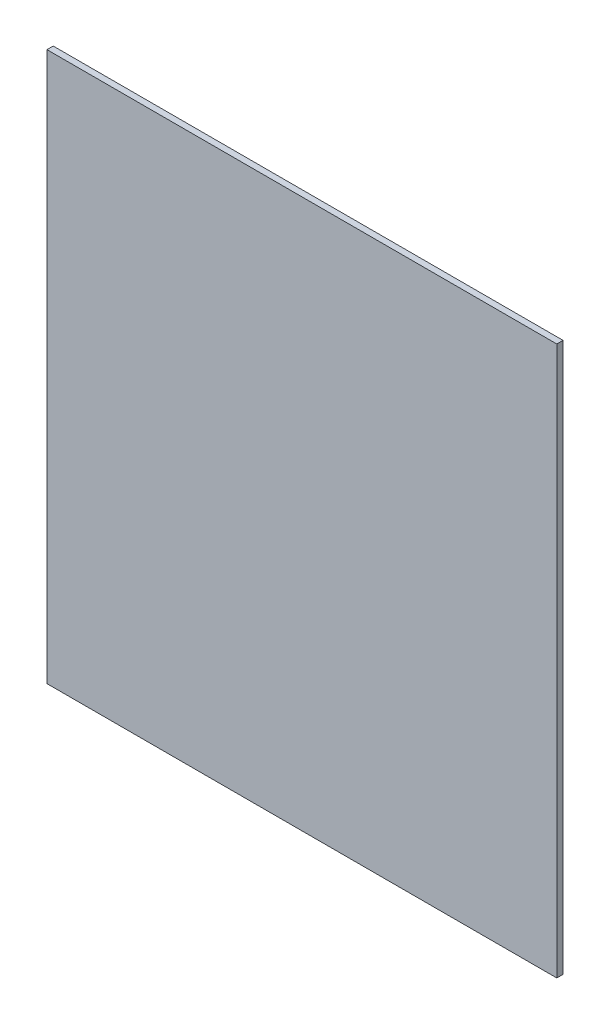
ISO-10303-21;
HEADER;
FILE_DESCRIPTION(('STEP AP214'),'2;1');
FILE_NAME('part.step','',(''),(''),'','','');
FILE_SCHEMA(('AUTOMOTIVE_DESIGN { 1 0 10303 214 1 1 1 1 }'));
ENDSEC;
DATA;
#1=APPLICATION_CONTEXT('core data for automotive mechanical design processes');
#2=APPLICATION_PROTOCOL_DEFINITION('international standard','automotive_design',2000,#1);
#3=PRODUCT_CONTEXT('',#1,'mechanical');
#4=PRODUCT('Part','Part','',(#3));
#5=PRODUCT_RELATED_PRODUCT_CATEGORY('part','',(#4));
#6=PRODUCT_DEFINITION_FORMATION('','',#4);
#7=PRODUCT_DEFINITION_CONTEXT('part definition',#1,'design');
#8=PRODUCT_DEFINITION('design','',#6,#7);
#9=PRODUCT_DEFINITION_SHAPE('','',#8);
#10=(LENGTH_UNIT() NAMED_UNIT(*) SI_UNIT(.MILLI.,.METRE.));
#11=(NAMED_UNIT(*) PLANE_ANGLE_UNIT() SI_UNIT($,.RADIAN.));
#12=(NAMED_UNIT(*) SI_UNIT($,.STERADIAN.) SOLID_ANGLE_UNIT());
#13=UNCERTAINTY_MEASURE_WITH_UNIT(LENGTH_MEASURE(1.E-05),#10,'distance_accuracy_value','');
#14=(GEOMETRIC_REPRESENTATION_CONTEXT(3) GLOBAL_UNCERTAINTY_ASSIGNED_CONTEXT((#13)) GLOBAL_UNIT_ASSIGNED_CONTEXT((#10,
#11,#12)) REPRESENTATION_CONTEXT('',''));
#15=CARTESIAN_POINT('',(0.,0.,0.));
#16=DIRECTION('',(0.,0.,1.));
#17=DIRECTION('',(1.,0.,0.));
#18=AXIS2_PLACEMENT_3D('',#15,#16,#17);
#19=CARTESIAN_POINT('',(-53.2088082243586,16.5000000000001,0.8));
#20=DIRECTION('',(1.,0.,0.));
#21=DIRECTION('',(0.,1.,0.));
#22=AXIS2_PLACEMENT_3D('',#19,#20,#21);
#23=PLANE('',#22);
#24=DIRECTION('',(0.,-1.,0.));
#25=VECTOR('',#24,1.);
#26=CARTESIAN_POINT('',(-53.2088082243586,16.5000000000001,0.));
#27=LINE('',#26,#25);
#28=CARTESIAN_POINT('',(-53.2088082243586,16.5000000000001,0.));
#29=VERTEX_POINT('',#28);
#30=CARTESIAN_POINT('',(-53.2088082243586,-53.4999999999999,0.));
#31=VERTEX_POINT('',#30);
#32=EDGE_CURVE('E96',#29,#31,#27,.T.);
#33=ORIENTED_EDGE('',*,*,#32,.T.);
#34=DIRECTION('',(0.,0.,-1.));
#35=VECTOR('',#34,1.);
#36=CARTESIAN_POINT('',(-53.2088082243586,-53.4999999999999,0.8));
#37=LINE('',#36,#35);
#38=CARTESIAN_POINT('',(-53.2088082243586,-53.4999999999999,0.8));
#39=VERTEX_POINT('',#38);
#40=EDGE_CURVE('E11',#39,#31,#37,.T.);
#41=ORIENTED_EDGE('',*,*,#40,.F.);
#42=DIRECTION('',(0.,-1.,0.));
#43=VECTOR('',#42,1.);
#44=CARTESIAN_POINT('',(-53.2088082243586,16.5000000000001,0.8));
#45=LINE('',#44,#43);
#46=CARTESIAN_POINT('',(-53.2088082243586,16.5000000000001,0.8));
#47=VERTEX_POINT('',#46);
#48=EDGE_CURVE('E84',#47,#39,#45,.T.);
#49=ORIENTED_EDGE('',*,*,#48,.F.);
#50=DIRECTION('',(0.,0.,-1.));
#51=VECTOR('',#50,1.);
#52=CARTESIAN_POINT('',(-53.2088082243586,16.5000000000001,0.8));
#53=LINE('',#52,#51);
#54=EDGE_CURVE('E92',#47,#29,#53,.T.);
#55=ORIENTED_EDGE('',*,*,#54,.T.);
#56=EDGE_LOOP('',(#33,#41,#49,#55));
#57=FACE_BOUND('',#56,.T.);
#58=ADVANCED_FACE('F33',(#57),#23,.F.);
#59=CARTESIAN_POINT('',(-53.2088082243586,-53.4999999999999,0.8));
#60=DIRECTION('',(0.,1.,0.));
#61=DIRECTION('',(0.,0.,1.));
#62=AXIS2_PLACEMENT_3D('',#59,#60,#61);
#63=PLANE('',#62);
#64=DIRECTION('',(1.,0.,0.));
#65=VECTOR('',#64,1.);
#66=CARTESIAN_POINT('',(-53.2088082243586,-53.4999999999999,0.));
#67=LINE('',#66,#65);
#68=CARTESIAN_POINT('',(11.7911917756414,-53.4999999999999,0.));
#69=VERTEX_POINT('',#68);
#70=EDGE_CURVE('E88',#31,#69,#67,.T.);
#71=ORIENTED_EDGE('',*,*,#70,.T.);
#72=DIRECTION('',(0.,0.,-1.));
#73=VECTOR('',#72,1.);
#74=CARTESIAN_POINT('',(11.7911917756414,-53.4999999999999,0.8));
#75=LINE('',#74,#73);
#76=CARTESIAN_POINT('',(11.7911917756414,-53.4999999999999,0.8));
#77=VERTEX_POINT('',#76);
#78=EDGE_CURVE('E41',#77,#69,#75,.T.);
#79=ORIENTED_EDGE('',*,*,#78,.F.);
#80=DIRECTION('',(1.,0.,0.));
#81=VECTOR('',#80,1.);
#82=CARTESIAN_POINT('',(-53.2088082243586,-53.4999999999999,0.8));
#83=LINE('',#82,#81);
#84=EDGE_CURVE('E79',#39,#77,#83,.T.);
#85=ORIENTED_EDGE('',*,*,#84,.F.);
#86=ORIENTED_EDGE('',*,*,#40,.T.);
#87=EDGE_LOOP('',(#71,#79,#85,#86));
#88=FACE_BOUND('',#87,.T.);
#89=ADVANCED_FACE('F87',(#88),#63,.F.);
#90=CARTESIAN_POINT('',(11.7911917756414,16.5000000000001,0.8));
#91=DIRECTION('',(-1.,0.,0.));
#92=DIRECTION('',(0.,-1.,0.));
#93=AXIS2_PLACEMENT_3D('',#90,#91,#92);
#94=PLANE('',#93);
#95=DIRECTION('',(0.,1.,0.));
#96=VECTOR('',#95,1.);
#97=CARTESIAN_POINT('',(11.7911917756414,16.5000000000001,0.));
#98=LINE('',#97,#96);
#99=CARTESIAN_POINT('',(11.7911917756414,16.5000000000001,0.));
#100=VERTEX_POINT('',#99);
#101=EDGE_CURVE('E66',#69,#100,#98,.T.);
#102=ORIENTED_EDGE('',*,*,#101,.T.);
#103=DIRECTION('',(0.,0.,-1.));
#104=VECTOR('',#103,1.);
#105=CARTESIAN_POINT('',(11.7911917756414,16.5000000000001,0.8));
#106=LINE('',#105,#104);
#107=CARTESIAN_POINT('',(11.7911917756414,16.5000000000001,0.8));
#108=VERTEX_POINT('',#107);
#109=EDGE_CURVE('E89',#108,#100,#106,.T.);
#110=ORIENTED_EDGE('',*,*,#109,.F.);
#111=DIRECTION('',(0.,1.,0.));
#112=VECTOR('',#111,1.);
#113=CARTESIAN_POINT('',(11.7911917756414,16.5000000000001,0.8));
#114=LINE('',#113,#112);
#115=EDGE_CURVE('E82',#77,#108,#114,.T.);
#116=ORIENTED_EDGE('',*,*,#115,.F.);
#117=ORIENTED_EDGE('',*,*,#78,.T.);
#118=EDGE_LOOP('',(#102,#110,#116,#117));
#119=FACE_BOUND('',#118,.T.);
#120=ADVANCED_FACE('F90',(#119),#94,.F.);
#121=CARTESIAN_POINT('',(-53.2088082243586,16.5000000000001,0.8));
#122=DIRECTION('',(0.,-1.,0.));
#123=DIRECTION('',(0.,0.,-1.));
#124=AXIS2_PLACEMENT_3D('',#121,#122,#123);
#125=PLANE('',#124);
#126=DIRECTION('',(-1.,0.,0.));
#127=VECTOR('',#126,1.);
#128=CARTESIAN_POINT('',(-53.2088082243586,16.5000000000001,0.));
#129=LINE('',#128,#127);
#130=EDGE_CURVE('E72',#100,#29,#129,.T.);
#131=ORIENTED_EDGE('',*,*,#130,.T.);
#132=ORIENTED_EDGE('',*,*,#54,.F.);
#133=DIRECTION('',(-1.,0.,0.));
#134=VECTOR('',#133,1.);
#135=CARTESIAN_POINT('',(-53.2088082243586,16.5000000000001,0.8));
#136=LINE('',#135,#134);
#137=EDGE_CURVE('E49',#108,#47,#136,.T.);
#138=ORIENTED_EDGE('',*,*,#137,.F.);
#139=ORIENTED_EDGE('',*,*,#109,.T.);
#140=EDGE_LOOP('',(#131,#132,#138,#139));
#141=FACE_BOUND('',#140,.T.);
#142=ADVANCED_FACE('F103',(#141),#125,.F.);
#143=CARTESIAN_POINT('',(0.,0.,0.8));
#144=DIRECTION('',(0.,0.,1.));
#145=DIRECTION('',(1.,0.,0.));
#146=AXIS2_PLACEMENT_3D('',#143,#144,#145);
#147=PLANE('',#146);
#148=ORIENTED_EDGE('',*,*,#48,.T.);
#149=ORIENTED_EDGE('',*,*,#84,.T.);
#150=ORIENTED_EDGE('',*,*,#115,.T.);
#151=ORIENTED_EDGE('',*,*,#137,.T.);
#152=EDGE_LOOP('',(#148,#149,#150,#151));
#153=FACE_BOUND('',#152,.T.);
#154=ADVANCED_FACE('F80',(#153),#147,.T.);
#155=CARTESIAN_POINT('',(0.,0.,0.));
#156=DIRECTION('',(0.,0.,1.));
#157=DIRECTION('',(1.,0.,0.));
#158=AXIS2_PLACEMENT_3D('',#155,#156,#157);
#159=PLANE('',#158);
#160=ORIENTED_EDGE('',*,*,#32,.F.);
#161=ORIENTED_EDGE('',*,*,#130,.F.);
#162=ORIENTED_EDGE('',*,*,#101,.F.);
#163=ORIENTED_EDGE('',*,*,#70,.F.);
#164=EDGE_LOOP('',(#160,#161,#162,#163));
#165=FACE_BOUND('',#164,.T.);
#166=ADVANCED_FACE('F106',(#165),#159,.F.);
#167=CLOSED_SHELL('',(#58,#89,#120,#142,#154,#166));
#168=MANIFOLD_SOLID_BREP('B2',#167);
#169=ADVANCED_BREP_SHAPE_REPRESENTATION('',(#18,#168),#14);
#170=SHAPE_DEFINITION_REPRESENTATION(#9,#169);
ENDSEC;
END-ISO-10303-21;
